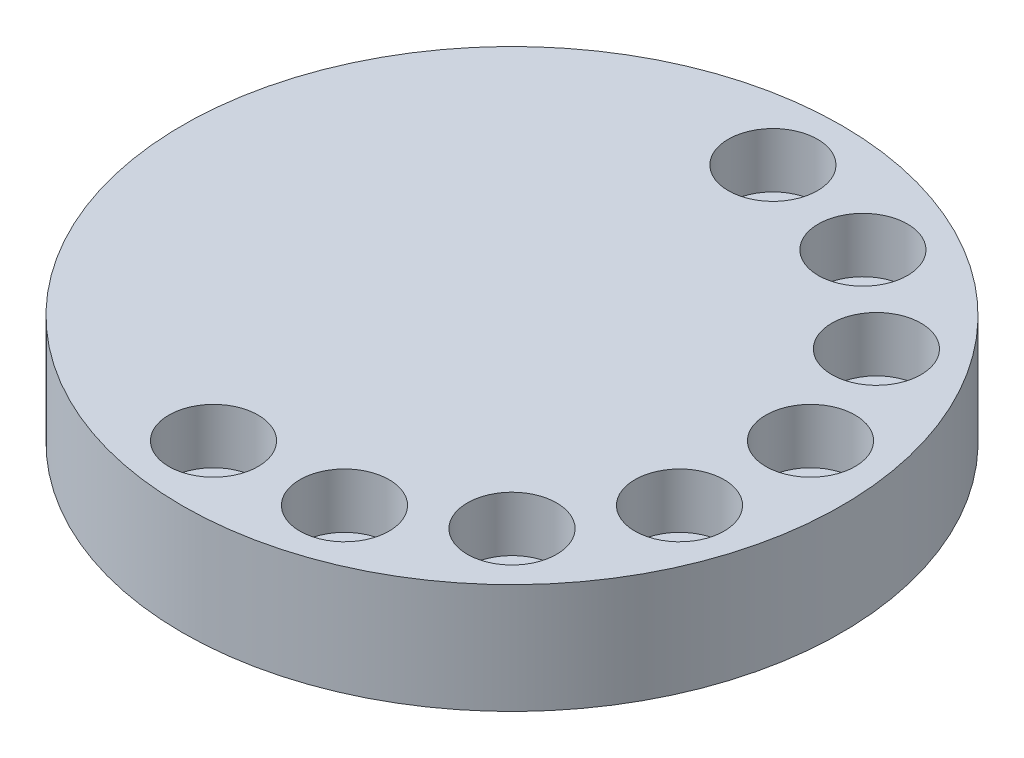
ISO-10303-21;
HEADER;
FILE_DESCRIPTION(('STEP AP214'),'2;1');
FILE_NAME('part.step','',(''),(''),'','','');
FILE_SCHEMA(('AUTOMOTIVE_DESIGN { 1 0 10303 214 1 1 1 1 }'));
ENDSEC;
DATA;
#1=APPLICATION_CONTEXT('core data for automotive mechanical design processes');
#2=APPLICATION_PROTOCOL_DEFINITION('international standard','automotive_design',2000,#1);
#3=PRODUCT_CONTEXT('',#1,'mechanical');
#4=PRODUCT('Part','Part','',(#3));
#5=PRODUCT_RELATED_PRODUCT_CATEGORY('part','',(#4));
#6=PRODUCT_DEFINITION_FORMATION('','',#4);
#7=PRODUCT_DEFINITION_CONTEXT('part definition',#1,'design');
#8=PRODUCT_DEFINITION('design','',#6,#7);
#9=PRODUCT_DEFINITION_SHAPE('','',#8);
#10=(LENGTH_UNIT() NAMED_UNIT(*) SI_UNIT(.MILLI.,.METRE.));
#11=(NAMED_UNIT(*) PLANE_ANGLE_UNIT() SI_UNIT($,.RADIAN.));
#12=(NAMED_UNIT(*) SI_UNIT($,.STERADIAN.) SOLID_ANGLE_UNIT());
#13=UNCERTAINTY_MEASURE_WITH_UNIT(LENGTH_MEASURE(1.E-05),#10,'distance_accuracy_value','');
#14=(GEOMETRIC_REPRESENTATION_CONTEXT(3) GLOBAL_UNCERTAINTY_ASSIGNED_CONTEXT((#13)) GLOBAL_UNIT_ASSIGNED_CONTEXT((#10,
#11,#12)) REPRESENTATION_CONTEXT('',''));
#15=CARTESIAN_POINT('',(0.,0.,0.));
#16=DIRECTION('',(0.,0.,1.));
#17=DIRECTION('',(1.,0.,0.));
#18=AXIS2_PLACEMENT_3D('',#15,#16,#17);
#19=CARTESIAN_POINT('',(0.,25.4,0.));
#20=DIRECTION('',(0.,-1.,0.));
#21=DIRECTION('',(0.,0.,-1.));
#22=AXIS2_PLACEMENT_3D('',#19,#20,#21);
#23=CYLINDRICAL_SURFACE('',#22,76.2);
#24=CARTESIAN_POINT('',(0.,25.4,0.));
#25=DIRECTION('',(0.,1.,0.));
#26=DIRECTION('',(0.,0.,1.));
#27=AXIS2_PLACEMENT_3D('',#24,#25,#26);
#28=CIRCLE('',#27,76.2);
#29=CARTESIAN_POINT('',(0.,25.4,76.2));
#30=VERTEX_POINT('',#29);
#31=EDGE_CURVE('E12',#30,#30,#28,.T.);
#32=ORIENTED_EDGE('',*,*,#31,.F.);
#33=EDGE_LOOP('',(#32));
#34=FACE_BOUND('',#33,.T.);
#35=CARTESIAN_POINT('',(0.,0.,0.));
#36=DIRECTION('',(0.,1.,0.));
#37=DIRECTION('',(0.,0.,1.));
#38=AXIS2_PLACEMENT_3D('',#35,#36,#37);
#39=CIRCLE('',#38,76.2);
#40=CARTESIAN_POINT('',(0.,0.,76.2));
#41=VERTEX_POINT('',#40);
#42=EDGE_CURVE('E47',#41,#41,#39,.T.);
#43=ORIENTED_EDGE('',*,*,#42,.T.);
#44=EDGE_LOOP('',(#43));
#45=FACE_BOUND('',#44,.T.);
#46=ADVANCED_FACE('F44',(#34,#45),#23,.T.);
#47=CARTESIAN_POINT('',(0.,25.4,0.));
#48=DIRECTION('',(0.,1.,0.));
#49=DIRECTION('',(0.,0.,1.));
#50=AXIS2_PLACEMENT_3D('',#47,#48,#49);
#51=PLANE('',#50);
#52=CARTESIAN_POINT('',(-9.43690910355229,25.4,59.5822991464016));
#53=DIRECTION('',(0.,1.,0.));
#54=DIRECTION('',(0.,0.,1.));
#55=AXIS2_PLACEMENT_3D('',#52,#53,#54);
#56=CIRCLE('',#55,10.31875);
#57=CARTESIAN_POINT('',(-9.43690910355229,25.4,69.9010491464016));
#58=VERTEX_POINT('',#57);
#59=EDGE_CURVE('E148',#58,#58,#56,.T.);
#60=ORIENTED_EDGE('',*,*,#59,.F.);
#61=EDGE_LOOP('',(#60));
#62=FACE_BOUND('',#61,.T.);
#63=CARTESIAN_POINT('',(18.6414501856684,25.4,57.3724843455052));
#64=DIRECTION('',(0.,1.,0.));
#65=DIRECTION('',(0.,0.,1.));
#66=AXIS2_PLACEMENT_3D('',#63,#64,#65);
#67=CIRCLE('',#66,10.31875);
#68=CARTESIAN_POINT('',(18.6414501856684,25.4,67.6912343455052));
#69=VERTEX_POINT('',#68);
#70=EDGE_CURVE('E136',#69,#69,#67,.T.);
#71=ORIENTED_EDGE('',*,*,#70,.F.);
#72=EDGE_LOOP('',(#71));
#73=FACE_BOUND('',#72,.T.);
#74=CARTESIAN_POINT('',(42.6562165750783,25.4,42.6562165750787));
#75=DIRECTION('',(0.,1.,0.));
#76=DIRECTION('',(0.,0.,1.));
#77=AXIS2_PLACEMENT_3D('',#74,#75,#76);
#78=CIRCLE('',#77,10.31875);
#79=CARTESIAN_POINT('',(42.6562165750783,25.4,52.9749665750787));
#80=VERTEX_POINT('',#79);
#81=EDGE_CURVE('E124',#80,#80,#78,.T.);
#82=ORIENTED_EDGE('',*,*,#81,.F.);
#83=EDGE_LOOP('',(#82));
#84=FACE_BOUND('',#83,.T.);
#85=CARTESIAN_POINT('',(57.3724843455051,25.4,18.6414501856689));
#86=DIRECTION('',(0.,1.,0.));
#87=DIRECTION('',(0.,0.,1.));
#88=AXIS2_PLACEMENT_3D('',#85,#86,#87);
#89=CIRCLE('',#88,10.31875);
#90=CARTESIAN_POINT('',(57.3724843455051,25.4,28.9602001856689));
#91=VERTEX_POINT('',#90);
#92=EDGE_CURVE('E112',#91,#91,#89,.T.);
#93=ORIENTED_EDGE('',*,*,#92,.F.);
#94=EDGE_LOOP('',(#93));
#95=FACE_BOUND('',#94,.T.);
#96=CARTESIAN_POINT('',(59.5822991464017,25.4,-9.43690910355177));
#97=DIRECTION('',(0.,1.,0.));
#98=DIRECTION('',(0.,0.,1.));
#99=AXIS2_PLACEMENT_3D('',#96,#97,#98);
#100=CIRCLE('',#99,10.31875);
#101=CARTESIAN_POINT('',(59.5822991464017,25.4,0.881840896448228));
#102=VERTEX_POINT('',#101);
#103=EDGE_CURVE('E100',#102,#102,#100,.T.);
#104=ORIENTED_EDGE('',*,*,#103,.F.);
#105=EDGE_LOOP('',(#104));
#106=FACE_BOUND('',#105,.T.);
#107=CARTESIAN_POINT('',(48.8039501856688,25.4,-35.4581453445434));
#108=DIRECTION('',(0.,1.,0.));
#109=DIRECTION('',(0.,0.,1.));
#110=AXIS2_PLACEMENT_3D('',#107,#108,#109);
#111=CIRCLE('',#110,10.31875);
#112=CARTESIAN_POINT('',(48.8039501856688,25.4,-25.1393953445434));
#113=VERTEX_POINT('',#112);
#114=EDGE_CURVE('E88',#113,#113,#111,.T.);
#115=ORIENTED_EDGE('',*,*,#114,.F.);
#116=EDGE_LOOP('',(#115));
#117=FACE_BOUND('',#116,.T.);
#118=CARTESIAN_POINT('',(27.3869768967882,25.4,-53.7499685716633));
#119=DIRECTION('',(0.,1.,0.));
#120=DIRECTION('',(0.,0.,1.));
#121=AXIS2_PLACEMENT_3D('',#118,#119,#120);
#122=CIRCLE('',#121,10.31875);
#123=CARTESIAN_POINT('',(27.3869768967882,25.4,-43.4312185716633));
#124=VERTEX_POINT('',#123);
#125=EDGE_CURVE('E76',#124,#124,#122,.T.);
#126=ORIENTED_EDGE('',*,*,#125,.F.);
#127=EDGE_LOOP('',(#126));
#128=FACE_BOUND('',#127,.T.);
#129=CARTESIAN_POINT('',(0.,25.4,-60.325));
#130=DIRECTION('',(0.,1.,0.));
#131=DIRECTION('',(0.,0.,1.));
#132=AXIS2_PLACEMENT_3D('',#129,#130,#131);
#133=CIRCLE('',#132,10.31875);
#134=CARTESIAN_POINT('',(0.,25.4,-50.00625));
#135=VERTEX_POINT('',#134);
#136=EDGE_CURVE('E64',#135,#135,#133,.T.);
#137=ORIENTED_EDGE('',*,*,#136,.F.);
#138=EDGE_LOOP('',(#137));
#139=FACE_BOUND('',#138,.T.);
#140=ORIENTED_EDGE('',*,*,#31,.T.);
#141=EDGE_LOOP('',(#140));
#142=FACE_BOUND('',#141,.T.);
#143=ADVANCED_FACE('F154',(#62,#73,#84,#95,#106,#117,#128,#139,#142),#51,.T.);
#144=CARTESIAN_POINT('',(0.,0.,0.));
#145=DIRECTION('',(0.,1.,0.));
#146=DIRECTION('',(0.,0.,1.));
#147=AXIS2_PLACEMENT_3D('',#144,#145,#146);
#148=PLANE('',#147);
#149=CARTESIAN_POINT('',(-9.43690910355229,0.,59.5822991464016));
#150=DIRECTION('',(0.,1.,0.));
#151=DIRECTION('',(0.,0.,1.));
#152=AXIS2_PLACEMENT_3D('',#149,#150,#151);
#153=CIRCLE('',#152,6.74624);
#154=CARTESIAN_POINT('',(-9.43690910355229,0.,66.3285391464016));
#155=VERTEX_POINT('',#154);
#156=EDGE_CURVE('E139',#155,#155,#153,.T.);
#157=ORIENTED_EDGE('',*,*,#156,.T.);
#158=EDGE_LOOP('',(#157));
#159=FACE_BOUND('',#158,.T.);
#160=CARTESIAN_POINT('',(18.6414501856684,0.,57.3724843455052));
#161=DIRECTION('',(0.,1.,0.));
#162=DIRECTION('',(0.,0.,1.));
#163=AXIS2_PLACEMENT_3D('',#160,#161,#162);
#164=CIRCLE('',#163,6.74624);
#165=CARTESIAN_POINT('',(18.6414501856684,0.,64.1187243455052));
#166=VERTEX_POINT('',#165);
#167=EDGE_CURVE('E127',#166,#166,#164,.T.);
#168=ORIENTED_EDGE('',*,*,#167,.T.);
#169=EDGE_LOOP('',(#168));
#170=FACE_BOUND('',#169,.T.);
#171=CARTESIAN_POINT('',(42.6562165750783,0.,42.6562165750787));
#172=DIRECTION('',(0.,1.,0.));
#173=DIRECTION('',(0.,0.,1.));
#174=AXIS2_PLACEMENT_3D('',#171,#172,#173);
#175=CIRCLE('',#174,6.74624);
#176=CARTESIAN_POINT('',(42.6562165750783,0.,49.4024565750787));
#177=VERTEX_POINT('',#176);
#178=EDGE_CURVE('E115',#177,#177,#175,.T.);
#179=ORIENTED_EDGE('',*,*,#178,.T.);
#180=EDGE_LOOP('',(#179));
#181=FACE_BOUND('',#180,.T.);
#182=CARTESIAN_POINT('',(57.3724843455051,0.,18.6414501856689));
#183=DIRECTION('',(0.,1.,0.));
#184=DIRECTION('',(0.,0.,1.));
#185=AXIS2_PLACEMENT_3D('',#182,#183,#184);
#186=CIRCLE('',#185,6.74624);
#187=CARTESIAN_POINT('',(57.3724843455051,0.,25.3876901856689));
#188=VERTEX_POINT('',#187);
#189=EDGE_CURVE('E103',#188,#188,#186,.T.);
#190=ORIENTED_EDGE('',*,*,#189,.T.);
#191=EDGE_LOOP('',(#190));
#192=FACE_BOUND('',#191,.T.);
#193=CARTESIAN_POINT('',(59.5822991464017,0.,-9.43690910355177));
#194=DIRECTION('',(0.,1.,0.));
#195=DIRECTION('',(0.,0.,1.));
#196=AXIS2_PLACEMENT_3D('',#193,#194,#195);
#197=CIRCLE('',#196,6.74624);
#198=CARTESIAN_POINT('',(59.5822991464017,0.,-2.69066910355177));
#199=VERTEX_POINT('',#198);
#200=EDGE_CURVE('E91',#199,#199,#197,.T.);
#201=ORIENTED_EDGE('',*,*,#200,.T.);
#202=EDGE_LOOP('',(#201));
#203=FACE_BOUND('',#202,.T.);
#204=CARTESIAN_POINT('',(48.8039501856688,0.,-35.4581453445434));
#205=DIRECTION('',(0.,1.,0.));
#206=DIRECTION('',(0.,0.,1.));
#207=AXIS2_PLACEMENT_3D('',#204,#205,#206);
#208=CIRCLE('',#207,6.74624);
#209=CARTESIAN_POINT('',(48.8039501856688,0.,-28.7119053445434));
#210=VERTEX_POINT('',#209);
#211=EDGE_CURVE('E79',#210,#210,#208,.T.);
#212=ORIENTED_EDGE('',*,*,#211,.T.);
#213=EDGE_LOOP('',(#212));
#214=FACE_BOUND('',#213,.T.);
#215=CARTESIAN_POINT('',(27.3869768967882,0.,-53.7499685716633));
#216=DIRECTION('',(0.,1.,0.));
#217=DIRECTION('',(0.,0.,1.));
#218=AXIS2_PLACEMENT_3D('',#215,#216,#217);
#219=CIRCLE('',#218,6.74624);
#220=CARTESIAN_POINT('',(27.3869768967882,0.,-47.0037285716633));
#221=VERTEX_POINT('',#220);
#222=EDGE_CURVE('E67',#221,#221,#219,.T.);
#223=ORIENTED_EDGE('',*,*,#222,.T.);
#224=EDGE_LOOP('',(#223));
#225=FACE_BOUND('',#224,.T.);
#226=CARTESIAN_POINT('',(0.,0.,-60.325));
#227=DIRECTION('',(0.,1.,0.));
#228=DIRECTION('',(0.,0.,1.));
#229=AXIS2_PLACEMENT_3D('',#226,#227,#228);
#230=CIRCLE('',#229,6.74624);
#231=CARTESIAN_POINT('',(0.,0.,-53.57876));
#232=VERTEX_POINT('',#231);
#233=EDGE_CURVE('E54',#232,#232,#230,.T.);
#234=ORIENTED_EDGE('',*,*,#233,.T.);
#235=EDGE_LOOP('',(#234));
#236=FACE_BOUND('',#235,.T.);
#237=ORIENTED_EDGE('',*,*,#42,.F.);
#238=EDGE_LOOP('',(#237));
#239=FACE_BOUND('',#238,.T.);
#240=ADVANCED_FACE('F157',(#159,#170,#181,#192,#203,#214,#225,#236,#239),#148,.F.);
#241=CARTESIAN_POINT('',(0.,25.4,-60.325));
#242=DIRECTION('',(0.,1.,0.));
#243=DIRECTION('',(0.,0.,1.));
#244=AXIS2_PLACEMENT_3D('',#241,#242,#243);
#245=CYLINDRICAL_SURFACE('',#244,6.74624);
#246=ORIENTED_EDGE('',*,*,#233,.F.);
#247=EDGE_LOOP('',(#246));
#248=FACE_BOUND('',#247,.T.);
#249=CARTESIAN_POINT('',(0.,12.7,-60.325));
#250=DIRECTION('',(0.,1.,0.));
#251=DIRECTION('',(0.,0.,1.));
#252=AXIS2_PLACEMENT_3D('',#249,#250,#251);
#253=CIRCLE('',#252,6.74624);
#254=CARTESIAN_POINT('',(0.,12.7,-53.57876));
#255=VERTEX_POINT('',#254);
#256=EDGE_CURVE('E58',#255,#255,#253,.T.);
#257=ORIENTED_EDGE('',*,*,#256,.T.);
#258=EDGE_LOOP('',(#257));
#259=FACE_BOUND('',#258,.T.);
#260=ADVANCED_FACE('F186',(#248,#259),#245,.F.);
#261=CARTESIAN_POINT('',(6.74624,12.7,-60.325));
#262=DIRECTION('',(0.,-1.,0.));
#263=DIRECTION('',(0.,0.,-1.));
#264=AXIS2_PLACEMENT_3D('',#261,#262,#263);
#265=PLANE('',#264);
#266=ORIENTED_EDGE('',*,*,#256,.F.);
#267=EDGE_LOOP('',(#266));
#268=FACE_BOUND('',#267,.T.);
#269=CARTESIAN_POINT('',(0.,12.7,-60.325));
#270=DIRECTION('',(0.,1.,0.));
#271=DIRECTION('',(0.,0.,1.));
#272=AXIS2_PLACEMENT_3D('',#269,#270,#271);
#273=CIRCLE('',#272,10.31875);
#274=CARTESIAN_POINT('',(0.,12.7,-50.00625));
#275=VERTEX_POINT('',#274);
#276=EDGE_CURVE('E61',#275,#275,#273,.T.);
#277=ORIENTED_EDGE('',*,*,#276,.T.);
#278=EDGE_LOOP('',(#277));
#279=FACE_BOUND('',#278,.T.);
#280=ADVANCED_FACE('F176',(#268,#279),#265,.F.);
#281=CARTESIAN_POINT('',(0.,25.4,-60.325));
#282=DIRECTION('',(0.,1.,0.));
#283=DIRECTION('',(0.,0.,1.));
#284=AXIS2_PLACEMENT_3D('',#281,#282,#283);
#285=CYLINDRICAL_SURFACE('',#284,10.31875);
#286=ORIENTED_EDGE('',*,*,#276,.F.);
#287=EDGE_LOOP('',(#286));
#288=FACE_BOUND('',#287,.T.);
#289=ORIENTED_EDGE('',*,*,#136,.T.);
#290=EDGE_LOOP('',(#289));
#291=FACE_BOUND('',#290,.T.);
#292=ADVANCED_FACE('F173',(#288,#291),#285,.F.);
#293=CARTESIAN_POINT('',(27.3869768967882,25.4,-53.7499685716633));
#294=DIRECTION('',(0.,1.,0.));
#295=DIRECTION('',(0.,0.,1.));
#296=AXIS2_PLACEMENT_3D('',#293,#294,#295);
#297=CYLINDRICAL_SURFACE('',#296,6.74624);
#298=ORIENTED_EDGE('',*,*,#222,.F.);
#299=EDGE_LOOP('',(#298));
#300=FACE_BOUND('',#299,.T.);
#301=CARTESIAN_POINT('',(27.3869768967882,12.7,-53.7499685716633));
#302=DIRECTION('',(0.,1.,0.));
#303=DIRECTION('',(0.,0.,1.));
#304=AXIS2_PLACEMENT_3D('',#301,#302,#303);
#305=CIRCLE('',#304,6.74624);
#306=CARTESIAN_POINT('',(27.3869768967882,12.7,-47.0037285716633));
#307=VERTEX_POINT('',#306);
#308=EDGE_CURVE('E70',#307,#307,#305,.T.);
#309=ORIENTED_EDGE('',*,*,#308,.T.);
#310=EDGE_LOOP('',(#309));
#311=FACE_BOUND('',#310,.T.);
#312=ADVANCED_FACE('F175',(#300,#311),#297,.F.);
#313=CARTESIAN_POINT('',(34.1332168967882,12.7,-53.7499685716633));
#314=DIRECTION('',(0.,-1.,0.));
#315=DIRECTION('',(0.,0.,-1.));
#316=AXIS2_PLACEMENT_3D('',#313,#314,#315);
#317=PLANE('',#316);
#318=ORIENTED_EDGE('',*,*,#308,.F.);
#319=EDGE_LOOP('',(#318));
#320=FACE_BOUND('',#319,.T.);
#321=CARTESIAN_POINT('',(27.3869768967882,12.7,-53.7499685716633));
#322=DIRECTION('',(0.,1.,0.));
#323=DIRECTION('',(0.,0.,1.));
#324=AXIS2_PLACEMENT_3D('',#321,#322,#323);
#325=CIRCLE('',#324,10.31875);
#326=CARTESIAN_POINT('',(27.3869768967882,12.7,-43.4312185716633));
#327=VERTEX_POINT('',#326);
#328=EDGE_CURVE('E73',#327,#327,#325,.T.);
#329=ORIENTED_EDGE('',*,*,#328,.T.);
#330=EDGE_LOOP('',(#329));
#331=FACE_BOUND('',#330,.T.);
#332=ADVANCED_FACE('F183',(#320,#331),#317,.F.);
#333=CARTESIAN_POINT('',(27.3869768967882,25.4,-53.7499685716633));
#334=DIRECTION('',(0.,1.,0.));
#335=DIRECTION('',(0.,0.,1.));
#336=AXIS2_PLACEMENT_3D('',#333,#334,#335);
#337=CYLINDRICAL_SURFACE('',#336,10.31875);
#338=ORIENTED_EDGE('',*,*,#328,.F.);
#339=EDGE_LOOP('',(#338));
#340=FACE_BOUND('',#339,.T.);
#341=ORIENTED_EDGE('',*,*,#125,.T.);
#342=EDGE_LOOP('',(#341));
#343=FACE_BOUND('',#342,.T.);
#344=ADVANCED_FACE('F227',(#340,#343),#337,.F.);
#345=CARTESIAN_POINT('',(48.8039501856688,25.4,-35.4581453445434));
#346=DIRECTION('',(0.,1.,0.));
#347=DIRECTION('',(0.,0.,1.));
#348=AXIS2_PLACEMENT_3D('',#345,#346,#347);
#349=CYLINDRICAL_SURFACE('',#348,6.74624);
#350=ORIENTED_EDGE('',*,*,#211,.F.);
#351=EDGE_LOOP('',(#350));
#352=FACE_BOUND('',#351,.T.);
#353=CARTESIAN_POINT('',(48.8039501856688,12.7,-35.4581453445434));
#354=DIRECTION('',(0.,1.,0.));
#355=DIRECTION('',(0.,0.,1.));
#356=AXIS2_PLACEMENT_3D('',#353,#354,#355);
#357=CIRCLE('',#356,6.74623999999999);
#358=CARTESIAN_POINT('',(48.8039501856688,12.7,-28.7119053445434));
#359=VERTEX_POINT('',#358);
#360=EDGE_CURVE('E82',#359,#359,#357,.T.);
#361=ORIENTED_EDGE('',*,*,#360,.T.);
#362=EDGE_LOOP('',(#361));
#363=FACE_BOUND('',#362,.T.);
#364=ADVANCED_FACE('F233',(#352,#363),#349,.F.);
#365=CARTESIAN_POINT('',(55.5501901856688,12.7,-35.4581453445434));
#366=DIRECTION('',(0.,-1.,0.));
#367=DIRECTION('',(0.,0.,-1.));
#368=AXIS2_PLACEMENT_3D('',#365,#366,#367);
#369=PLANE('',#368);
#370=ORIENTED_EDGE('',*,*,#360,.F.);
#371=EDGE_LOOP('',(#370));
#372=FACE_BOUND('',#371,.T.);
#373=CARTESIAN_POINT('',(48.8039501856688,12.7,-35.4581453445434));
#374=DIRECTION('',(0.,1.,0.));
#375=DIRECTION('',(0.,0.,1.));
#376=AXIS2_PLACEMENT_3D('',#373,#374,#375);
#377=CIRCLE('',#376,10.31875);
#378=CARTESIAN_POINT('',(48.8039501856688,12.7,-25.1393953445434));
#379=VERTEX_POINT('',#378);
#380=EDGE_CURVE('E85',#379,#379,#377,.T.);
#381=ORIENTED_EDGE('',*,*,#380,.T.);
#382=EDGE_LOOP('',(#381));
#383=FACE_BOUND('',#382,.T.);
#384=ADVANCED_FACE('F238',(#372,#383),#369,.F.);
#385=CARTESIAN_POINT('',(48.8039501856688,25.4,-35.4581453445434));
#386=DIRECTION('',(0.,1.,0.));
#387=DIRECTION('',(0.,0.,1.));
#388=AXIS2_PLACEMENT_3D('',#385,#386,#387);
#389=CYLINDRICAL_SURFACE('',#388,10.31875);
#390=ORIENTED_EDGE('',*,*,#380,.F.);
#391=EDGE_LOOP('',(#390));
#392=FACE_BOUND('',#391,.T.);
#393=ORIENTED_EDGE('',*,*,#114,.T.);
#394=EDGE_LOOP('',(#393));
#395=FACE_BOUND('',#394,.T.);
#396=ADVANCED_FACE('F244',(#392,#395),#389,.F.);
#397=CARTESIAN_POINT('',(59.5822991464017,25.4,-9.43690910355177));
#398=DIRECTION('',(0.,1.,0.));
#399=DIRECTION('',(0.,0.,1.));
#400=AXIS2_PLACEMENT_3D('',#397,#398,#399);
#401=CYLINDRICAL_SURFACE('',#400,6.74624);
#402=ORIENTED_EDGE('',*,*,#200,.F.);
#403=EDGE_LOOP('',(#402));
#404=FACE_BOUND('',#403,.T.);
#405=CARTESIAN_POINT('',(59.5822991464017,12.7,-9.43690910355177));
#406=DIRECTION('',(0.,1.,0.));
#407=DIRECTION('',(0.,0.,1.));
#408=AXIS2_PLACEMENT_3D('',#405,#406,#407);
#409=CIRCLE('',#408,6.74624);
#410=CARTESIAN_POINT('',(59.5822991464017,12.7,-2.69066910355177));
#411=VERTEX_POINT('',#410);
#412=EDGE_CURVE('E94',#411,#411,#409,.T.);
#413=ORIENTED_EDGE('',*,*,#412,.T.);
#414=EDGE_LOOP('',(#413));
#415=FACE_BOUND('',#414,.T.);
#416=ADVANCED_FACE('F248',(#404,#415),#401,.F.);
#417=CARTESIAN_POINT('',(66.3285391464017,12.7,-9.43690910355177));
#418=DIRECTION('',(0.,-1.,0.));
#419=DIRECTION('',(0.,0.,-1.));
#420=AXIS2_PLACEMENT_3D('',#417,#418,#419);
#421=PLANE('',#420);
#422=ORIENTED_EDGE('',*,*,#412,.F.);
#423=EDGE_LOOP('',(#422));
#424=FACE_BOUND('',#423,.T.);
#425=CARTESIAN_POINT('',(59.5822991464017,12.7,-9.43690910355177));
#426=DIRECTION('',(0.,1.,0.));
#427=DIRECTION('',(0.,0.,1.));
#428=AXIS2_PLACEMENT_3D('',#425,#426,#427);
#429=CIRCLE('',#428,10.31875);
#430=CARTESIAN_POINT('',(59.5822991464017,12.7,0.881840896448228));
#431=VERTEX_POINT('',#430);
#432=EDGE_CURVE('E97',#431,#431,#429,.T.);
#433=ORIENTED_EDGE('',*,*,#432,.T.);
#434=EDGE_LOOP('',(#433));
#435=FACE_BOUND('',#434,.T.);
#436=ADVANCED_FACE('F252',(#424,#435),#421,.F.);
#437=CARTESIAN_POINT('',(59.5822991464017,25.4,-9.43690910355177));
#438=DIRECTION('',(0.,1.,0.));
#439=DIRECTION('',(0.,0.,1.));
#440=AXIS2_PLACEMENT_3D('',#437,#438,#439);
#441=CYLINDRICAL_SURFACE('',#440,10.31875);
#442=ORIENTED_EDGE('',*,*,#432,.F.);
#443=EDGE_LOOP('',(#442));
#444=FACE_BOUND('',#443,.T.);
#445=ORIENTED_EDGE('',*,*,#103,.T.);
#446=EDGE_LOOP('',(#445));
#447=FACE_BOUND('',#446,.T.);
#448=ADVANCED_FACE('F256',(#444,#447),#441,.F.);
#449=CARTESIAN_POINT('',(57.3724843455051,25.4,18.6414501856689));
#450=DIRECTION('',(0.,1.,0.));
#451=DIRECTION('',(0.,0.,1.));
#452=AXIS2_PLACEMENT_3D('',#449,#450,#451);
#453=CYLINDRICAL_SURFACE('',#452,6.74624);
#454=ORIENTED_EDGE('',*,*,#189,.F.);
#455=EDGE_LOOP('',(#454));
#456=FACE_BOUND('',#455,.T.);
#457=CARTESIAN_POINT('',(57.3724843455051,12.7,18.6414501856689));
#458=DIRECTION('',(0.,1.,0.));
#459=DIRECTION('',(0.,0.,1.));
#460=AXIS2_PLACEMENT_3D('',#457,#458,#459);
#461=CIRCLE('',#460,6.74624);
#462=CARTESIAN_POINT('',(57.3724843455051,12.7,25.3876901856689));
#463=VERTEX_POINT('',#462);
#464=EDGE_CURVE('E106',#463,#463,#461,.T.);
#465=ORIENTED_EDGE('',*,*,#464,.T.);
#466=EDGE_LOOP('',(#465));
#467=FACE_BOUND('',#466,.T.);
#468=ADVANCED_FACE('F260',(#456,#467),#453,.F.);
#469=CARTESIAN_POINT('',(64.1187243455051,12.7,18.6414501856689));
#470=DIRECTION('',(0.,-1.,0.));
#471=DIRECTION('',(0.,0.,-1.));
#472=AXIS2_PLACEMENT_3D('',#469,#470,#471);
#473=PLANE('',#472);
#474=ORIENTED_EDGE('',*,*,#464,.F.);
#475=EDGE_LOOP('',(#474));
#476=FACE_BOUND('',#475,.T.);
#477=CARTESIAN_POINT('',(57.3724843455051,12.7,18.6414501856689));
#478=DIRECTION('',(0.,1.,0.));
#479=DIRECTION('',(0.,0.,1.));
#480=AXIS2_PLACEMENT_3D('',#477,#478,#479);
#481=CIRCLE('',#480,10.31875);
#482=CARTESIAN_POINT('',(57.3724843455051,12.7,28.9602001856689));
#483=VERTEX_POINT('',#482);
#484=EDGE_CURVE('E109',#483,#483,#481,.T.);
#485=ORIENTED_EDGE('',*,*,#484,.T.);
#486=EDGE_LOOP('',(#485));
#487=FACE_BOUND('',#486,.T.);
#488=ADVANCED_FACE('F264',(#476,#487),#473,.F.);
#489=CARTESIAN_POINT('',(57.3724843455051,25.4,18.6414501856689));
#490=DIRECTION('',(0.,1.,0.));
#491=DIRECTION('',(0.,0.,1.));
#492=AXIS2_PLACEMENT_3D('',#489,#490,#491);
#493=CYLINDRICAL_SURFACE('',#492,10.31875);
#494=ORIENTED_EDGE('',*,*,#484,.F.);
#495=EDGE_LOOP('',(#494));
#496=FACE_BOUND('',#495,.T.);
#497=ORIENTED_EDGE('',*,*,#92,.T.);
#498=EDGE_LOOP('',(#497));
#499=FACE_BOUND('',#498,.T.);
#500=ADVANCED_FACE('F268',(#496,#499),#493,.F.);
#501=CARTESIAN_POINT('',(42.6562165750783,25.4,42.6562165750787));
#502=DIRECTION('',(0.,1.,0.));
#503=DIRECTION('',(0.,0.,1.));
#504=AXIS2_PLACEMENT_3D('',#501,#502,#503);
#505=CYLINDRICAL_SURFACE('',#504,6.74624);
#506=ORIENTED_EDGE('',*,*,#178,.F.);
#507=EDGE_LOOP('',(#506));
#508=FACE_BOUND('',#507,.T.);
#509=CARTESIAN_POINT('',(42.6562165750783,12.7,42.6562165750787));
#510=DIRECTION('',(0.,1.,0.));
#511=DIRECTION('',(0.,0.,1.));
#512=AXIS2_PLACEMENT_3D('',#509,#510,#511);
#513=CIRCLE('',#512,6.74623999999999);
#514=CARTESIAN_POINT('',(42.6562165750783,12.7,49.4024565750787));
#515=VERTEX_POINT('',#514);
#516=EDGE_CURVE('E118',#515,#515,#513,.T.);
#517=ORIENTED_EDGE('',*,*,#516,.T.);
#518=EDGE_LOOP('',(#517));
#519=FACE_BOUND('',#518,.T.);
#520=ADVANCED_FACE('F272',(#508,#519),#505,.F.);
#521=CARTESIAN_POINT('',(49.4024565750783,12.7,42.6562165750787));
#522=DIRECTION('',(0.,-1.,0.));
#523=DIRECTION('',(0.,0.,-1.));
#524=AXIS2_PLACEMENT_3D('',#521,#522,#523);
#525=PLANE('',#524);
#526=ORIENTED_EDGE('',*,*,#516,.F.);
#527=EDGE_LOOP('',(#526));
#528=FACE_BOUND('',#527,.T.);
#529=CARTESIAN_POINT('',(42.6562165750783,12.7,42.6562165750787));
#530=DIRECTION('',(0.,1.,0.));
#531=DIRECTION('',(0.,0.,1.));
#532=AXIS2_PLACEMENT_3D('',#529,#530,#531);
#533=CIRCLE('',#532,10.31875);
#534=CARTESIAN_POINT('',(42.6562165750783,12.7,52.9749665750787));
#535=VERTEX_POINT('',#534);
#536=EDGE_CURVE('E121',#535,#535,#533,.T.);
#537=ORIENTED_EDGE('',*,*,#536,.T.);
#538=EDGE_LOOP('',(#537));
#539=FACE_BOUND('',#538,.T.);
#540=ADVANCED_FACE('F276',(#528,#539),#525,.F.);
#541=CARTESIAN_POINT('',(42.6562165750783,25.4,42.6562165750787));
#542=DIRECTION('',(0.,1.,0.));
#543=DIRECTION('',(0.,0.,1.));
#544=AXIS2_PLACEMENT_3D('',#541,#542,#543);
#545=CYLINDRICAL_SURFACE('',#544,10.31875);
#546=ORIENTED_EDGE('',*,*,#536,.F.);
#547=EDGE_LOOP('',(#546));
#548=FACE_BOUND('',#547,.T.);
#549=ORIENTED_EDGE('',*,*,#81,.T.);
#550=EDGE_LOOP('',(#549));
#551=FACE_BOUND('',#550,.T.);
#552=ADVANCED_FACE('F280',(#548,#551),#545,.F.);
#553=CARTESIAN_POINT('',(18.6414501856684,25.4,57.3724843455052));
#554=DIRECTION('',(0.,1.,0.));
#555=DIRECTION('',(0.,0.,1.));
#556=AXIS2_PLACEMENT_3D('',#553,#554,#555);
#557=CYLINDRICAL_SURFACE('',#556,6.74624);
#558=ORIENTED_EDGE('',*,*,#167,.F.);
#559=EDGE_LOOP('',(#558));
#560=FACE_BOUND('',#559,.T.);
#561=CARTESIAN_POINT('',(18.6414501856684,12.7,57.3724843455052));
#562=DIRECTION('',(0.,1.,0.));
#563=DIRECTION('',(0.,0.,1.));
#564=AXIS2_PLACEMENT_3D('',#561,#562,#563);
#565=CIRCLE('',#564,6.74624);
#566=CARTESIAN_POINT('',(18.6414501856684,12.7,64.1187243455052));
#567=VERTEX_POINT('',#566);
#568=EDGE_CURVE('E130',#567,#567,#565,.T.);
#569=ORIENTED_EDGE('',*,*,#568,.T.);
#570=EDGE_LOOP('',(#569));
#571=FACE_BOUND('',#570,.T.);
#572=ADVANCED_FACE('F284',(#560,#571),#557,.F.);
#573=CARTESIAN_POINT('',(25.3876901856684,12.7,57.3724843455052));
#574=DIRECTION('',(0.,-1.,0.));
#575=DIRECTION('',(0.,0.,-1.));
#576=AXIS2_PLACEMENT_3D('',#573,#574,#575);
#577=PLANE('',#576);
#578=ORIENTED_EDGE('',*,*,#568,.F.);
#579=EDGE_LOOP('',(#578));
#580=FACE_BOUND('',#579,.T.);
#581=CARTESIAN_POINT('',(18.6414501856684,12.7,57.3724843455052));
#582=DIRECTION('',(0.,1.,0.));
#583=DIRECTION('',(0.,0.,1.));
#584=AXIS2_PLACEMENT_3D('',#581,#582,#583);
#585=CIRCLE('',#584,10.31875);
#586=CARTESIAN_POINT('',(18.6414501856684,12.7,67.6912343455052));
#587=VERTEX_POINT('',#586);
#588=EDGE_CURVE('E133',#587,#587,#585,.T.);
#589=ORIENTED_EDGE('',*,*,#588,.T.);
#590=EDGE_LOOP('',(#589));
#591=FACE_BOUND('',#590,.T.);
#592=ADVANCED_FACE('F288',(#580,#591),#577,.F.);
#593=CARTESIAN_POINT('',(18.6414501856684,25.4,57.3724843455052));
#594=DIRECTION('',(0.,1.,0.));
#595=DIRECTION('',(0.,0.,1.));
#596=AXIS2_PLACEMENT_3D('',#593,#594,#595);
#597=CYLINDRICAL_SURFACE('',#596,10.31875);
#598=ORIENTED_EDGE('',*,*,#588,.F.);
#599=EDGE_LOOP('',(#598));
#600=FACE_BOUND('',#599,.T.);
#601=ORIENTED_EDGE('',*,*,#70,.T.);
#602=EDGE_LOOP('',(#601));
#603=FACE_BOUND('',#602,.T.);
#604=ADVANCED_FACE('F292',(#600,#603),#597,.F.);
#605=CARTESIAN_POINT('',(-9.43690910355229,25.4,59.5822991464016));
#606=DIRECTION('',(0.,1.,0.));
#607=DIRECTION('',(0.,0.,1.));
#608=AXIS2_PLACEMENT_3D('',#605,#606,#607);
#609=CYLINDRICAL_SURFACE('',#608,6.74624);
#610=ORIENTED_EDGE('',*,*,#156,.F.);
#611=EDGE_LOOP('',(#610));
#612=FACE_BOUND('',#611,.T.);
#613=CARTESIAN_POINT('',(-9.43690910355229,12.7,59.5822991464016));
#614=DIRECTION('',(0.,1.,0.));
#615=DIRECTION('',(0.,0.,1.));
#616=AXIS2_PLACEMENT_3D('',#613,#614,#615);
#617=CIRCLE('',#616,6.74624);
#618=CARTESIAN_POINT('',(-9.43690910355229,12.7,66.3285391464016));
#619=VERTEX_POINT('',#618);
#620=EDGE_CURVE('E142',#619,#619,#617,.T.);
#621=ORIENTED_EDGE('',*,*,#620,.T.);
#622=EDGE_LOOP('',(#621));
#623=FACE_BOUND('',#622,.T.);
#624=ADVANCED_FACE('F296',(#612,#623),#609,.F.);
#625=CARTESIAN_POINT('',(-2.69066910355229,12.7,59.5822991464016));
#626=DIRECTION('',(0.,-1.,0.));
#627=DIRECTION('',(0.,0.,-1.));
#628=AXIS2_PLACEMENT_3D('',#625,#626,#627);
#629=PLANE('',#628);
#630=ORIENTED_EDGE('',*,*,#620,.F.);
#631=EDGE_LOOP('',(#630));
#632=FACE_BOUND('',#631,.T.);
#633=CARTESIAN_POINT('',(-9.43690910355229,12.7,59.5822991464016));
#634=DIRECTION('',(0.,1.,0.));
#635=DIRECTION('',(0.,0.,1.));
#636=AXIS2_PLACEMENT_3D('',#633,#634,#635);
#637=CIRCLE('',#636,10.31875);
#638=CARTESIAN_POINT('',(-9.43690910355229,12.7,69.9010491464016));
#639=VERTEX_POINT('',#638);
#640=EDGE_CURVE('E145',#639,#639,#637,.T.);
#641=ORIENTED_EDGE('',*,*,#640,.T.);
#642=EDGE_LOOP('',(#641));
#643=FACE_BOUND('',#642,.T.);
#644=ADVANCED_FACE('F300',(#632,#643),#629,.F.);
#645=CARTESIAN_POINT('',(-9.43690910355229,25.4,59.5822991464016));
#646=DIRECTION('',(0.,1.,0.));
#647=DIRECTION('',(0.,0.,1.));
#648=AXIS2_PLACEMENT_3D('',#645,#646,#647);
#649=CYLINDRICAL_SURFACE('',#648,10.31875);
#650=ORIENTED_EDGE('',*,*,#640,.F.);
#651=EDGE_LOOP('',(#650));
#652=FACE_BOUND('',#651,.T.);
#653=ORIENTED_EDGE('',*,*,#59,.T.);
#654=EDGE_LOOP('',(#653));
#655=FACE_BOUND('',#654,.T.);
#656=ADVANCED_FACE('F152',(#652,#655),#649,.F.);
#657=CLOSED_SHELL('',(#46,#143,#240,#260,#280,#292,#312,#332,#344,#364,#384,#396,#416,#436,#448,
#468,#488,#500,#520,#540,#552,#572,#592,#604,#624,#644,#656));
#658=MANIFOLD_SOLID_BREP('B2',#657);
#659=ADVANCED_BREP_SHAPE_REPRESENTATION('',(#18,#658),#14);
#660=SHAPE_DEFINITION_REPRESENTATION(#9,#659);
ENDSEC;
END-ISO-10303-21;
